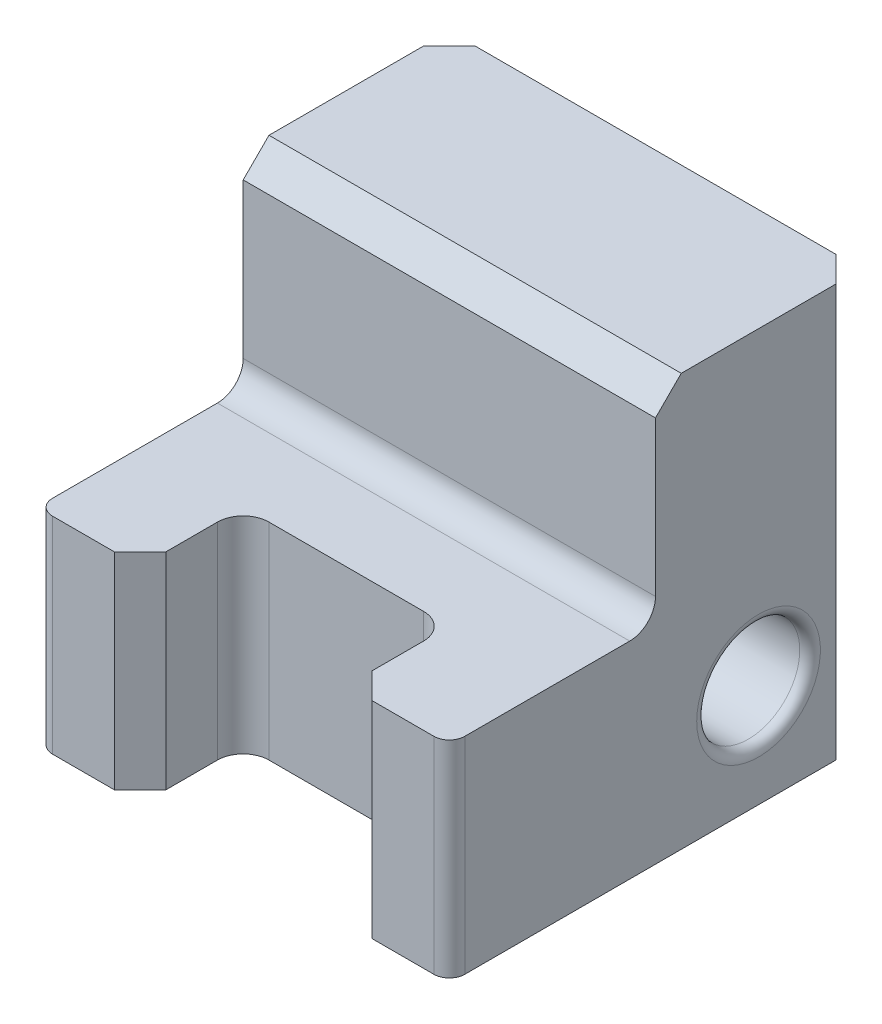
ISO-10303-21;
HEADER;
FILE_DESCRIPTION(('STEP AP214'),'2;1');
FILE_NAME('part.step','',(''),(''),'','','');
FILE_SCHEMA(('AUTOMOTIVE_DESIGN { 1 0 10303 214 1 1 1 1 }'));
ENDSEC;
DATA;
#1=APPLICATION_CONTEXT('core data for automotive mechanical design processes');
#2=APPLICATION_PROTOCOL_DEFINITION('international standard','automotive_design',2000,#1);
#3=PRODUCT_CONTEXT('',#1,'mechanical');
#4=PRODUCT('Part','Part','',(#3));
#5=PRODUCT_RELATED_PRODUCT_CATEGORY('part','',(#4));
#6=PRODUCT_DEFINITION_FORMATION('','',#4);
#7=PRODUCT_DEFINITION_CONTEXT('part definition',#1,'design');
#8=PRODUCT_DEFINITION('design','',#6,#7);
#9=PRODUCT_DEFINITION_SHAPE('','',#8);
#10=(LENGTH_UNIT() NAMED_UNIT(*) SI_UNIT(.MILLI.,.METRE.));
#11=(NAMED_UNIT(*) PLANE_ANGLE_UNIT() SI_UNIT($,.RADIAN.));
#12=(NAMED_UNIT(*) SI_UNIT($,.STERADIAN.) SOLID_ANGLE_UNIT());
#13=UNCERTAINTY_MEASURE_WITH_UNIT(LENGTH_MEASURE(1.E-05),#10,'distance_accuracy_value','');
#14=(GEOMETRIC_REPRESENTATION_CONTEXT(3) GLOBAL_UNCERTAINTY_ASSIGNED_CONTEXT((#13)) GLOBAL_UNIT_ASSIGNED_CONTEXT((#10,
#11,#12)) REPRESENTATION_CONTEXT('',''));
#15=CARTESIAN_POINT('',(0.,0.,0.));
#16=DIRECTION('',(0.,0.,1.));
#17=DIRECTION('',(1.,0.,0.));
#18=AXIS2_PLACEMENT_3D('',#15,#16,#17);
#19=CARTESIAN_POINT('',(80.,0.,80.));
#20=DIRECTION('',(0.,0.,-1.));
#21=DIRECTION('',(-1.,0.,0.));
#22=AXIS2_PLACEMENT_3D('',#19,#20,#21);
#23=PLANE('',#22);
#24=DIRECTION('',(-1.,0.,0.));
#25=VECTOR('',#24,1.);
#26=CARTESIAN_POINT('',(80.,0.,80.));
#27=LINE('',#26,#25);
#28=CARTESIAN_POINT('',(15.,0.,80.));
#29=VERTEX_POINT('',#28);
#30=CARTESIAN_POINT('',(3.,0.,80.));
#31=VERTEX_POINT('',#30);
#32=EDGE_CURVE('E317',#29,#31,#27,.T.);
#33=ORIENTED_EDGE('',*,*,#32,.F.);
#34=DIRECTION('',(0.,1.,0.));
#35=VECTOR('',#34,1.);
#36=CARTESIAN_POINT('',(15.,0.,80.));
#37=LINE('',#36,#35);
#38=CARTESIAN_POINT('',(15.,40.,80.));
#39=VERTEX_POINT('',#38);
#40=EDGE_CURVE('E234',#29,#39,#37,.T.);
#41=ORIENTED_EDGE('',*,*,#40,.T.);
#42=DIRECTION('',(-1.,0.,0.));
#43=VECTOR('',#42,1.);
#44=CARTESIAN_POINT('',(80.,40.,80.));
#45=LINE('',#44,#43);
#46=CARTESIAN_POINT('',(3.,40.,80.));
#47=VERTEX_POINT('',#46);
#48=EDGE_CURVE('E332',#39,#47,#45,.T.);
#49=ORIENTED_EDGE('',*,*,#48,.T.);
#50=DIRECTION('',(0.,-1.,0.));
#51=VECTOR('',#50,1.);
#52=CARTESIAN_POINT('',(3.,0.,80.));
#53=LINE('',#52,#51);
#54=EDGE_CURVE('E194',#47,#31,#53,.T.);
#55=ORIENTED_EDGE('',*,*,#54,.T.);
#56=EDGE_LOOP('',(#33,#41,#49,#55));
#57=FACE_BOUND('',#56,.T.);
#58=ADVANCED_FACE('F35',(#57),#23,.F.);
#59=CARTESIAN_POINT('',(80.,0.,0.));
#60=DIRECTION('',(-1.,0.,0.));
#61=DIRECTION('',(0.,0.,1.));
#62=AXIS2_PLACEMENT_3D('',#59,#60,#61);
#63=PLANE('',#62);
#64=CARTESIAN_POINT('',(80.,20.,20.));
#65=DIRECTION('',(-1.,0.,0.));
#66=DIRECTION('',(0.,0.,1.));
#67=AXIS2_PLACEMENT_3D('',#64,#65,#66);
#68=CIRCLE('',#67,12.);
#69=CARTESIAN_POINT('',(80.,20.,32.));
#70=VERTEX_POINT('',#69);
#71=EDGE_CURVE('E283',#70,#70,#68,.T.);
#72=ORIENTED_EDGE('',*,*,#71,.T.);
#73=EDGE_LOOP('',(#72));
#74=FACE_BOUND('',#73,.T.);
#75=DIRECTION('',(0.,0.,-1.));
#76=VECTOR('',#75,1.);
#77=CARTESIAN_POINT('',(80.,0.,0.));
#78=LINE('',#77,#76);
#79=CARTESIAN_POINT('',(80.,0.,77.));
#80=VERTEX_POINT('',#79);
#81=CARTESIAN_POINT('',(80.,0.,4.99999999999999));
#82=VERTEX_POINT('',#81);
#83=EDGE_CURVE('E183',#80,#82,#78,.T.);
#84=ORIENTED_EDGE('',*,*,#83,.T.);
#85=DIRECTION('',(0.,1.,0.));
#86=VECTOR('',#85,1.);
#87=CARTESIAN_POINT('',(80.,0.,4.99999999999999));
#88=LINE('',#87,#86);
#89=CARTESIAN_POINT('',(80.,80.,4.99999999999999));
#90=VERTEX_POINT('',#89);
#91=EDGE_CURVE('E286',#82,#90,#88,.T.);
#92=ORIENTED_EDGE('',*,*,#91,.T.);
#93=DIRECTION('',(0.,0.,1.));
#94=VECTOR('',#93,1.);
#95=CARTESIAN_POINT('',(80.,80.,40.));
#96=LINE('',#95,#94);
#97=CARTESIAN_POINT('',(80.,80.,35.));
#98=VERTEX_POINT('',#97);
#99=EDGE_CURVE('E310',#90,#98,#96,.T.);
#100=ORIENTED_EDGE('',*,*,#99,.T.);
#101=DIRECTION('',(0.,0.707106781186547,-0.707106781186549));
#102=VECTOR('',#101,1.);
#103=CARTESIAN_POINT('',(80.,75.,40.));
#104=LINE('',#103,#102);
#105=CARTESIAN_POINT('',(80.,75.,40.));
#106=VERTEX_POINT('',#105);
#107=EDGE_CURVE('E272',#98,#106,#104,.F.);
#108=ORIENTED_EDGE('',*,*,#107,.T.);
#109=DIRECTION('',(0.,-1.,0.));
#110=VECTOR('',#109,1.);
#111=CARTESIAN_POINT('',(80.,40.,40.));
#112=LINE('',#111,#110);
#113=CARTESIAN_POINT('',(80.,45.,40.));
#114=VERTEX_POINT('',#113);
#115=EDGE_CURVE('E184',#106,#114,#112,.T.);
#116=ORIENTED_EDGE('',*,*,#115,.T.);
#117=CARTESIAN_POINT('',(80.,45.,45.));
#118=DIRECTION('',(-1.,0.,0.));
#119=DIRECTION('',(0.,0.,1.));
#120=AXIS2_PLACEMENT_3D('',#117,#118,#119);
#121=CIRCLE('',#120,5.);
#122=CARTESIAN_POINT('',(80.,40.,45.));
#123=VERTEX_POINT('',#122);
#124=EDGE_CURVE('E179',#114,#123,#121,.T.);
#125=ORIENTED_EDGE('',*,*,#124,.T.);
#126=DIRECTION('',(0.,0.,1.));
#127=VECTOR('',#126,1.);
#128=CARTESIAN_POINT('',(80.,40.,80.));
#129=LINE('',#128,#127);
#130=CARTESIAN_POINT('',(80.,40.,77.));
#131=VERTEX_POINT('',#130);
#132=EDGE_CURVE('E171',#123,#131,#129,.T.);
#133=ORIENTED_EDGE('',*,*,#132,.T.);
#134=DIRECTION('',(0.,-1.,0.));
#135=VECTOR('',#134,1.);
#136=CARTESIAN_POINT('',(80.,0.,77.));
#137=LINE('',#136,#135);
#138=EDGE_CURVE('E176',#131,#80,#137,.T.);
#139=ORIENTED_EDGE('',*,*,#138,.T.);
#140=EDGE_LOOP('',(#84,#92,#100,#108,#116,#125,#133,#139));
#141=FACE_BOUND('',#140,.T.);
#142=ADVANCED_FACE('F174',(#74,#141),#63,.F.);
#143=CARTESIAN_POINT('',(0.,0.,0.));
#144=DIRECTION('',(-1.,0.,0.));
#145=DIRECTION('',(0.,0.,1.));
#146=AXIS2_PLACEMENT_3D('',#143,#144,#145);
#147=PLANE('',#146);
#148=CARTESIAN_POINT('',(0.,20.,20.));
#149=DIRECTION('',(-1.,0.,0.));
#150=DIRECTION('',(0.,0.,1.));
#151=AXIS2_PLACEMENT_3D('',#148,#149,#150);
#152=CIRCLE('',#151,12.);
#153=CARTESIAN_POINT('',(0.,20.,32.));
#154=VERTEX_POINT('',#153);
#155=EDGE_CURVE('E274',#154,#154,#152,.F.);
#156=ORIENTED_EDGE('',*,*,#155,.T.);
#157=EDGE_LOOP('',(#156));
#158=FACE_BOUND('',#157,.T.);
#159=DIRECTION('',(0.,0.,1.));
#160=VECTOR('',#159,1.);
#161=CARTESIAN_POINT('',(0.,80.,40.));
#162=LINE('',#161,#160);
#163=CARTESIAN_POINT('',(0.,80.,5.));
#164=VERTEX_POINT('',#163);
#165=CARTESIAN_POINT('',(0.,80.,35.));
#166=VERTEX_POINT('',#165);
#167=EDGE_CURVE('E321',#164,#166,#162,.T.);
#168=ORIENTED_EDGE('',*,*,#167,.F.);
#169=DIRECTION('',(0.,-1.,0.));
#170=VECTOR('',#169,1.);
#171=CARTESIAN_POINT('',(0.,0.,5.));
#172=LINE('',#171,#170);
#173=CARTESIAN_POINT('',(0.,0.,5.));
#174=VERTEX_POINT('',#173);
#175=EDGE_CURVE('E43',#164,#174,#172,.T.);
#176=ORIENTED_EDGE('',*,*,#175,.T.);
#177=DIRECTION('',(0.,0.,-1.));
#178=VECTOR('',#177,1.);
#179=CARTESIAN_POINT('',(0.,0.,0.));
#180=LINE('',#179,#178);
#181=CARTESIAN_POINT('',(0.,0.,77.));
#182=VERTEX_POINT('',#181);
#183=EDGE_CURVE('E328',#182,#174,#180,.T.);
#184=ORIENTED_EDGE('',*,*,#183,.F.);
#185=DIRECTION('',(0.,-1.,0.));
#186=VECTOR('',#185,1.);
#187=CARTESIAN_POINT('',(0.,40.,77.));
#188=LINE('',#187,#186);
#189=CARTESIAN_POINT('',(0.,40.,77.));
#190=VERTEX_POINT('',#189);
#191=EDGE_CURVE('E213',#182,#190,#188,.F.);
#192=ORIENTED_EDGE('',*,*,#191,.T.);
#193=DIRECTION('',(0.,0.,1.));
#194=VECTOR('',#193,1.);
#195=CARTESIAN_POINT('',(0.,40.,80.));
#196=LINE('',#195,#194);
#197=CARTESIAN_POINT('',(0.,40.,45.));
#198=VERTEX_POINT('',#197);
#199=EDGE_CURVE('E326',#198,#190,#196,.T.);
#200=ORIENTED_EDGE('',*,*,#199,.F.);
#201=CARTESIAN_POINT('',(0.,45.,45.));
#202=DIRECTION('',(-1.,0.,0.));
#203=DIRECTION('',(0.,0.,1.));
#204=AXIS2_PLACEMENT_3D('',#201,#202,#203);
#205=CIRCLE('',#204,5.);
#206=CARTESIAN_POINT('',(0.,45.,40.));
#207=VERTEX_POINT('',#206);
#208=EDGE_CURVE('E259',#198,#207,#205,.F.);
#209=ORIENTED_EDGE('',*,*,#208,.T.);
#210=DIRECTION('',(0.,-1.,0.));
#211=VECTOR('',#210,1.);
#212=CARTESIAN_POINT('',(0.,40.,40.));
#213=LINE('',#212,#211);
#214=CARTESIAN_POINT('',(0.,75.,40.));
#215=VERTEX_POINT('',#214);
#216=EDGE_CURVE('E323',#215,#207,#213,.T.);
#217=ORIENTED_EDGE('',*,*,#216,.F.);
#218=DIRECTION('',(0.,-0.707106781186547,0.707106781186549));
#219=VECTOR('',#218,1.);
#220=CARTESIAN_POINT('',(0.,57.5000000000001,57.4999999999999));
#221=LINE('',#220,#219);
#222=EDGE_CURVE('E266',#215,#166,#221,.F.);
#223=ORIENTED_EDGE('',*,*,#222,.T.);
#224=EDGE_LOOP('',(#168,#176,#184,#192,#200,#209,#217,#223));
#225=FACE_BOUND('',#224,.T.);
#226=ADVANCED_FACE('F348',(#158,#225),#147,.T.);
#227=CARTESIAN_POINT('',(80.,80.,0.));
#228=DIRECTION('',(0.,0.,1.));
#229=DIRECTION('',(0.,-1.,0.));
#230=AXIS2_PLACEMENT_3D('',#227,#228,#229);
#231=PLANE('',#230);
#232=DIRECTION('',(-1.,0.,0.));
#233=VECTOR('',#232,1.);
#234=CARTESIAN_POINT('',(80.,0.,0.));
#235=LINE('',#234,#233);
#236=CARTESIAN_POINT('',(75.,0.,0.));
#237=VERTEX_POINT('',#236);
#238=CARTESIAN_POINT('',(4.99999999999999,0.,0.));
#239=VERTEX_POINT('',#238);
#240=EDGE_CURVE('E305',#237,#239,#235,.T.);
#241=ORIENTED_EDGE('',*,*,#240,.T.);
#242=DIRECTION('',(0.,1.,0.));
#243=VECTOR('',#242,1.);
#244=CARTESIAN_POINT('',(4.99999999999999,80.,0.));
#245=LINE('',#244,#243);
#246=CARTESIAN_POINT('',(4.99999999999999,80.,0.));
#247=VERTEX_POINT('',#246);
#248=EDGE_CURVE('E295',#239,#247,#245,.T.);
#249=ORIENTED_EDGE('',*,*,#248,.T.);
#250=DIRECTION('',(-1.,0.,0.));
#251=VECTOR('',#250,1.);
#252=CARTESIAN_POINT('',(80.,80.,0.));
#253=LINE('',#252,#251);
#254=CARTESIAN_POINT('',(75.,80.,0.));
#255=VERTEX_POINT('',#254);
#256=EDGE_CURVE('E200',#255,#247,#253,.T.);
#257=ORIENTED_EDGE('',*,*,#256,.F.);
#258=DIRECTION('',(0.,-1.,0.));
#259=VECTOR('',#258,1.);
#260=CARTESIAN_POINT('',(75.,80.,0.));
#261=LINE('',#260,#259);
#262=EDGE_CURVE('E291',#255,#237,#261,.T.);
#263=ORIENTED_EDGE('',*,*,#262,.T.);
#264=EDGE_LOOP('',(#241,#249,#257,#263));
#265=FACE_BOUND('',#264,.T.);
#266=ADVANCED_FACE('F302',(#265),#231,.F.);
#267=CARTESIAN_POINT('',(80.,80.,40.));
#268=DIRECTION('',(0.,-1.,0.));
#269=DIRECTION('',(0.,0.,-1.));
#270=AXIS2_PLACEMENT_3D('',#267,#268,#269);
#271=PLANE('',#270);
#272=ORIENTED_EDGE('',*,*,#256,.T.);
#273=DIRECTION('',(-0.707106781186547,0.,0.707106781186549));
#274=VECTOR('',#273,1.);
#275=CARTESIAN_POINT('',(4.99999999999999,80.,0.));
#276=LINE('',#275,#274);
#277=EDGE_CURVE('E57',#247,#164,#276,.T.);
#278=ORIENTED_EDGE('',*,*,#277,.T.);
#279=ORIENTED_EDGE('',*,*,#167,.T.);
#280=DIRECTION('',(1.,0.,0.));
#281=VECTOR('',#280,1.);
#282=CARTESIAN_POINT('',(80.,80.,35.));
#283=LINE('',#282,#281);
#284=EDGE_CURVE('E269',#166,#98,#283,.T.);
#285=ORIENTED_EDGE('',*,*,#284,.T.);
#286=ORIENTED_EDGE('',*,*,#99,.F.);
#287=DIRECTION('',(0.707106781186549,0.,0.707106781186547));
#288=VECTOR('',#287,1.);
#289=CARTESIAN_POINT('',(80.,80.,4.99999999999999));
#290=LINE('',#289,#288);
#291=EDGE_CURVE('E289',#90,#255,#290,.F.);
#292=ORIENTED_EDGE('',*,*,#291,.T.);
#293=EDGE_LOOP('',(#272,#278,#279,#285,#286,#292));
#294=FACE_BOUND('',#293,.T.);
#295=ADVANCED_FACE('F308',(#294),#271,.F.);
#296=CARTESIAN_POINT('',(80.,40.,40.));
#297=DIRECTION('',(0.,0.,-1.));
#298=DIRECTION('',(-1.,0.,0.));
#299=AXIS2_PLACEMENT_3D('',#296,#297,#298);
#300=PLANE('',#299);
#301=ORIENTED_EDGE('',*,*,#115,.F.);
#302=DIRECTION('',(-1.,0.,0.));
#303=VECTOR('',#302,1.);
#304=CARTESIAN_POINT('',(80.,75.,40.));
#305=LINE('',#304,#303);
#306=EDGE_CURVE('E263',#106,#215,#305,.T.);
#307=ORIENTED_EDGE('',*,*,#306,.T.);
#308=ORIENTED_EDGE('',*,*,#216,.T.);
#309=DIRECTION('',(-1.,0.,0.));
#310=VECTOR('',#309,1.);
#311=CARTESIAN_POINT('',(80.,45.,40.));
#312=LINE('',#311,#310);
#313=EDGE_CURVE('E256',#207,#114,#312,.F.);
#314=ORIENTED_EDGE('',*,*,#313,.T.);
#315=EDGE_LOOP('',(#301,#307,#308,#314));
#316=FACE_BOUND('',#315,.T.);
#317=ADVANCED_FACE('F355',(#316),#300,.F.);
#318=CARTESIAN_POINT('',(80.,40.,80.));
#319=DIRECTION('',(0.,-1.,0.));
#320=DIRECTION('',(0.,0.,-1.));
#321=AXIS2_PLACEMENT_3D('',#318,#319,#320);
#322=PLANE('',#321);
#323=ORIENTED_EDGE('',*,*,#132,.F.);
#324=DIRECTION('',(-1.,0.,0.));
#325=VECTOR('',#324,1.);
#326=CARTESIAN_POINT('',(0.,40.,45.));
#327=LINE('',#326,#325);
#328=EDGE_CURVE('E254',#123,#198,#327,.T.);
#329=ORIENTED_EDGE('',*,*,#328,.T.);
#330=ORIENTED_EDGE('',*,*,#199,.T.);
#331=CARTESIAN_POINT('',(3.,40.,77.));
#332=DIRECTION('',(0.,-1.,0.));
#333=DIRECTION('',(0.,0.,-1.));
#334=AXIS2_PLACEMENT_3D('',#331,#332,#333);
#335=CIRCLE('',#334,3.);
#336=EDGE_CURVE('E195',#190,#47,#335,.F.);
#337=ORIENTED_EDGE('',*,*,#336,.T.);
#338=ORIENTED_EDGE('',*,*,#48,.F.);
#339=DIRECTION('',(-0.70710678118655,0.,0.707106781186545));
#340=VECTOR('',#339,1.);
#341=CARTESIAN_POINT('',(20.,40.,75.));
#342=LINE('',#341,#340);
#343=CARTESIAN_POINT('',(20.,40.,75.));
#344=VERTEX_POINT('',#343);
#345=EDGE_CURVE('E227',#39,#344,#342,.F.);
#346=ORIENTED_EDGE('',*,*,#345,.T.);
#347=DIRECTION('',(0.,0.,-1.));
#348=VECTOR('',#347,1.);
#349=CARTESIAN_POINT('',(20.,40.,80.));
#350=LINE('',#349,#348);
#351=CARTESIAN_POINT('',(20.,40.,65.));
#352=VERTEX_POINT('',#351);
#353=EDGE_CURVE('E324',#344,#352,#350,.T.);
#354=ORIENTED_EDGE('',*,*,#353,.T.);
#355=CARTESIAN_POINT('',(25.,40.,65.));
#356=DIRECTION('',(0.,-1.,0.));
#357=DIRECTION('',(0.,0.,-1.));
#358=AXIS2_PLACEMENT_3D('',#355,#356,#357);
#359=CIRCLE('',#358,5.);
#360=CARTESIAN_POINT('',(25.,40.,60.));
#361=VERTEX_POINT('',#360);
#362=EDGE_CURVE('E248',#352,#361,#359,.T.);
#363=ORIENTED_EDGE('',*,*,#362,.T.);
#364=DIRECTION('',(1.,0.,0.));
#365=VECTOR('',#364,1.);
#366=CARTESIAN_POINT('',(80.,40.,60.));
#367=LINE('',#366,#365);
#368=CARTESIAN_POINT('',(55.,40.,60.));
#369=VERTEX_POINT('',#368);
#370=EDGE_CURVE('E463',#361,#369,#367,.T.);
#371=ORIENTED_EDGE('',*,*,#370,.T.);
#372=CARTESIAN_POINT('',(55.,40.,65.));
#373=DIRECTION('',(0.,-1.,0.));
#374=DIRECTION('',(0.,0.,-1.));
#375=AXIS2_PLACEMENT_3D('',#372,#373,#374);
#376=CIRCLE('',#375,5.);
#377=CARTESIAN_POINT('',(60.,40.,65.));
#378=VERTEX_POINT('',#377);
#379=EDGE_CURVE('E252',#369,#378,#376,.T.);
#380=ORIENTED_EDGE('',*,*,#379,.T.);
#381=DIRECTION('',(0.,0.,1.));
#382=VECTOR('',#381,1.);
#383=CARTESIAN_POINT('',(60.,40.,80.));
#384=LINE('',#383,#382);
#385=CARTESIAN_POINT('',(60.,40.,75.));
#386=VERTEX_POINT('',#385);
#387=EDGE_CURVE('E458',#378,#386,#384,.T.);
#388=ORIENTED_EDGE('',*,*,#387,.T.);
#389=DIRECTION('',(-0.707106781186544,0.,-0.707106781186551));
#390=VECTOR('',#389,1.);
#391=CARTESIAN_POINT('',(64.9999999999999,40.,80.));
#392=LINE('',#391,#390);
#393=CARTESIAN_POINT('',(64.9999999999999,40.,80.));
#394=VERTEX_POINT('',#393);
#395=EDGE_CURVE('E229',#386,#394,#392,.F.);
#396=ORIENTED_EDGE('',*,*,#395,.T.);
#397=CARTESIAN_POINT('',(77.,40.,80.));
#398=VERTEX_POINT('',#397);
#399=EDGE_CURVE('E191',#398,#394,#45,.T.);
#400=ORIENTED_EDGE('',*,*,#399,.F.);
#401=CARTESIAN_POINT('',(77.,40.,77.));
#402=DIRECTION('',(0.,-1.,0.));
#403=DIRECTION('',(0.,0.,-1.));
#404=AXIS2_PLACEMENT_3D('',#401,#402,#403);
#405=CIRCLE('',#404,3.);
#406=EDGE_CURVE('E188',#398,#131,#405,.F.);
#407=ORIENTED_EDGE('',*,*,#406,.T.);
#408=EDGE_LOOP('',(#323,#329,#330,#337,#338,#346,#354,#363,#371,#380,#388,#396,#400,#407));
#409=FACE_BOUND('',#408,.T.);
#410=ADVANCED_FACE('F189',(#409),#322,.F.);
#411=ORIENTED_EDGE('',*,*,#399,.T.);
#412=DIRECTION('',(0.,-1.,0.));
#413=VECTOR('',#412,1.);
#414=CARTESIAN_POINT('',(64.9999999999999,0.,80.));
#415=LINE('',#414,#413);
#416=CARTESIAN_POINT('',(64.9999999999999,0.,80.));
#417=VERTEX_POINT('',#416);
#418=EDGE_CURVE('E216',#394,#417,#415,.T.);
#419=ORIENTED_EDGE('',*,*,#418,.T.);
#420=CARTESIAN_POINT('',(77.,0.,80.));
#421=VERTEX_POINT('',#420);
#422=EDGE_CURVE('E330',#421,#417,#27,.T.);
#423=ORIENTED_EDGE('',*,*,#422,.F.);
#424=DIRECTION('',(0.,-1.,0.));
#425=VECTOR('',#424,1.);
#426=CARTESIAN_POINT('',(77.,0.,80.));
#427=LINE('',#426,#425);
#428=EDGE_CURVE('E207',#421,#398,#427,.F.);
#429=ORIENTED_EDGE('',*,*,#428,.T.);
#430=EDGE_LOOP('',(#411,#419,#423,#429));
#431=FACE_BOUND('',#430,.T.);
#432=ADVANCED_FACE('F368',(#431),#23,.F.);
#433=CARTESIAN_POINT('',(80.,0.,0.));
#434=DIRECTION('',(0.,1.,0.));
#435=DIRECTION('',(0.,0.,1.));
#436=AXIS2_PLACEMENT_3D('',#433,#434,#435);
#437=PLANE('',#436);
#438=ORIENTED_EDGE('',*,*,#183,.T.);
#439=DIRECTION('',(0.707106781186547,0.,-0.707106781186549));
#440=VECTOR('',#439,1.);
#441=CARTESIAN_POINT('',(5.,0.,0.));
#442=LINE('',#441,#440);
#443=EDGE_CURVE('E12',#174,#239,#442,.T.);
#444=ORIENTED_EDGE('',*,*,#443,.T.);
#445=ORIENTED_EDGE('',*,*,#240,.F.);
#446=DIRECTION('',(-0.707106781186549,0.,-0.707106781186547));
#447=VECTOR('',#446,1.);
#448=CARTESIAN_POINT('',(80.,0.,4.99999999999999));
#449=LINE('',#448,#447);
#450=EDGE_CURVE('E293',#237,#82,#449,.F.);
#451=ORIENTED_EDGE('',*,*,#450,.T.);
#452=ORIENTED_EDGE('',*,*,#83,.F.);
#453=CARTESIAN_POINT('',(77.,0.,77.));
#454=DIRECTION('',(0.,1.,0.));
#455=DIRECTION('',(0.,0.,1.));
#456=AXIS2_PLACEMENT_3D('',#453,#454,#455);
#457=CIRCLE('',#456,3.);
#458=EDGE_CURVE('E198',#80,#421,#457,.F.);
#459=ORIENTED_EDGE('',*,*,#458,.T.);
#460=ORIENTED_EDGE('',*,*,#422,.T.);
#461=DIRECTION('',(0.707106781186544,0.,0.707106781186551));
#462=VECTOR('',#461,1.);
#463=CARTESIAN_POINT('',(64.9999999999999,0.,80.));
#464=LINE('',#463,#462);
#465=CARTESIAN_POINT('',(60.,0.,75.));
#466=VERTEX_POINT('',#465);
#467=EDGE_CURVE('E221',#417,#466,#464,.F.);
#468=ORIENTED_EDGE('',*,*,#467,.T.);
#469=DIRECTION('',(0.,0.,1.));
#470=VECTOR('',#469,1.);
#471=CARTESIAN_POINT('',(60.,0.,80.));
#472=LINE('',#471,#470);
#473=CARTESIAN_POINT('',(60.,0.,65.));
#474=VERTEX_POINT('',#473);
#475=EDGE_CURVE('E470',#474,#466,#472,.T.);
#476=ORIENTED_EDGE('',*,*,#475,.F.);
#477=CARTESIAN_POINT('',(55.,0.,65.));
#478=DIRECTION('',(0.,1.,0.));
#479=DIRECTION('',(0.,0.,1.));
#480=AXIS2_PLACEMENT_3D('',#477,#478,#479);
#481=CIRCLE('',#480,5.);
#482=CARTESIAN_POINT('',(55.,0.,60.));
#483=VERTEX_POINT('',#482);
#484=EDGE_CURVE('E250',#474,#483,#481,.T.);
#485=ORIENTED_EDGE('',*,*,#484,.T.);
#486=DIRECTION('',(1.,0.,0.));
#487=VECTOR('',#486,1.);
#488=CARTESIAN_POINT('',(20.,0.,60.));
#489=LINE('',#488,#487);
#490=CARTESIAN_POINT('',(25.,0.,60.));
#491=VERTEX_POINT('',#490);
#492=EDGE_CURVE('E469',#491,#483,#489,.T.);
#493=ORIENTED_EDGE('',*,*,#492,.F.);
#494=CARTESIAN_POINT('',(25.,0.,65.));
#495=DIRECTION('',(0.,1.,0.));
#496=DIRECTION('',(0.,0.,1.));
#497=AXIS2_PLACEMENT_3D('',#494,#495,#496);
#498=CIRCLE('',#497,5.);
#499=CARTESIAN_POINT('',(20.,0.,65.));
#500=VERTEX_POINT('',#499);
#501=EDGE_CURVE('E246',#491,#500,#498,.T.);
#502=ORIENTED_EDGE('',*,*,#501,.T.);
#503=DIRECTION('',(0.,0.,-1.));
#504=VECTOR('',#503,1.);
#505=CARTESIAN_POINT('',(20.,0.,80.));
#506=LINE('',#505,#504);
#507=CARTESIAN_POINT('',(20.,0.,75.));
#508=VERTEX_POINT('',#507);
#509=EDGE_CURVE('E474',#508,#500,#506,.T.);
#510=ORIENTED_EDGE('',*,*,#509,.F.);
#511=DIRECTION('',(0.70710678118655,0.,-0.707106781186545));
#512=VECTOR('',#511,1.);
#513=CARTESIAN_POINT('',(20.,0.,75.));
#514=LINE('',#513,#512);
#515=EDGE_CURVE('E219',#508,#29,#514,.F.);
#516=ORIENTED_EDGE('',*,*,#515,.T.);
#517=ORIENTED_EDGE('',*,*,#32,.T.);
#518=CARTESIAN_POINT('',(3.,0.,77.));
#519=DIRECTION('',(0.,1.,0.));
#520=DIRECTION('',(0.,0.,1.));
#521=AXIS2_PLACEMENT_3D('',#518,#519,#520);
#522=CIRCLE('',#521,3.);
#523=EDGE_CURVE('E199',#31,#182,#522,.F.);
#524=ORIENTED_EDGE('',*,*,#523,.T.);
#525=EDGE_LOOP('',(#438,#444,#445,#451,#452,#459,#460,#468,#476,#485,#493,#502,#510,#516,#517,#524));
#526=FACE_BOUND('',#525,.T.);
#527=ADVANCED_FACE('F347',(#526),#437,.F.);
#528=CARTESIAN_POINT('',(80.,20.,20.));
#529=DIRECTION('',(-1.,0.,0.));
#530=DIRECTION('',(0.,0.,1.));
#531=AXIS2_PLACEMENT_3D('',#528,#529,#530);
#532=CYLINDRICAL_SURFACE('',#531,10.);
#533=CARTESIAN_POINT('',(78.,20.,20.));
#534=DIRECTION('',(-1.,0.,0.));
#535=DIRECTION('',(0.,0.,1.));
#536=AXIS2_PLACEMENT_3D('',#533,#534,#535);
#537=CIRCLE('',#536,10.);
#538=CARTESIAN_POINT('',(78.,20.,30.));
#539=VERTEX_POINT('',#538);
#540=EDGE_CURVE('E280',#539,#539,#537,.F.);
#541=ORIENTED_EDGE('',*,*,#540,.T.);
#542=EDGE_LOOP('',(#541));
#543=FACE_BOUND('',#542,.T.);
#544=CARTESIAN_POINT('',(2.,20.,20.));
#545=DIRECTION('',(-1.,0.,0.));
#546=DIRECTION('',(0.,0.,1.));
#547=AXIS2_PLACEMENT_3D('',#544,#545,#546);
#548=CIRCLE('',#547,10.);
#549=CARTESIAN_POINT('',(2.,20.,30.));
#550=VERTEX_POINT('',#549);
#551=EDGE_CURVE('E277',#550,#550,#548,.T.);
#552=ORIENTED_EDGE('',*,*,#551,.T.);
#553=EDGE_LOOP('',(#552));
#554=FACE_BOUND('',#553,.T.);
#555=ADVANCED_FACE('F382',(#543,#554),#532,.F.);
#556=CARTESIAN_POINT('',(20.,80.,80.));
#557=DIRECTION('',(-1.,0.,0.));
#558=DIRECTION('',(0.,0.,1.));
#559=AXIS2_PLACEMENT_3D('',#556,#557,#558);
#560=PLANE('',#559);
#561=ORIENTED_EDGE('',*,*,#509,.T.);
#562=DIRECTION('',(0.,-1.,0.));
#563=VECTOR('',#562,1.);
#564=CARTESIAN_POINT('',(20.,40.,65.));
#565=LINE('',#564,#563);
#566=EDGE_CURVE('E241',#500,#352,#565,.F.);
#567=ORIENTED_EDGE('',*,*,#566,.T.);
#568=ORIENTED_EDGE('',*,*,#353,.F.);
#569=DIRECTION('',(0.,-1.,0.));
#570=VECTOR('',#569,1.);
#571=CARTESIAN_POINT('',(20.,80.,75.));
#572=LINE('',#571,#570);
#573=EDGE_CURVE('E231',#344,#508,#572,.T.);
#574=ORIENTED_EDGE('',*,*,#573,.T.);
#575=EDGE_LOOP('',(#561,#567,#568,#574));
#576=FACE_BOUND('',#575,.T.);
#577=ADVANCED_FACE('F434',(#576),#560,.F.);
#578=CARTESIAN_POINT('',(60.,80.,80.));
#579=DIRECTION('',(1.,0.,0.));
#580=DIRECTION('',(0.,0.,-1.));
#581=AXIS2_PLACEMENT_3D('',#578,#579,#580);
#582=PLANE('',#581);
#583=ORIENTED_EDGE('',*,*,#387,.F.);
#584=DIRECTION('',(0.,-1.,0.));
#585=VECTOR('',#584,1.);
#586=CARTESIAN_POINT('',(60.,0.,65.));
#587=LINE('',#586,#585);
#588=EDGE_CURVE('E243',#378,#474,#587,.T.);
#589=ORIENTED_EDGE('',*,*,#588,.T.);
#590=ORIENTED_EDGE('',*,*,#475,.T.);
#591=DIRECTION('',(0.,1.,0.));
#592=VECTOR('',#591,1.);
#593=CARTESIAN_POINT('',(60.,80.,75.));
#594=LINE('',#593,#592);
#595=EDGE_CURVE('E224',#466,#386,#594,.T.);
#596=ORIENTED_EDGE('',*,*,#595,.T.);
#597=EDGE_LOOP('',(#583,#589,#590,#596));
#598=FACE_BOUND('',#597,.T.);
#599=ADVANCED_FACE('F448',(#598),#582,.F.);
#600=CARTESIAN_POINT('',(20.,80.,60.));
#601=DIRECTION('',(0.,0.,-1.));
#602=DIRECTION('',(-1.,0.,0.));
#603=AXIS2_PLACEMENT_3D('',#600,#601,#602);
#604=PLANE('',#603);
#605=ORIENTED_EDGE('',*,*,#370,.F.);
#606=DIRECTION('',(0.,-1.,0.));
#607=VECTOR('',#606,1.);
#608=CARTESIAN_POINT('',(25.,0.,60.));
#609=LINE('',#608,#607);
#610=EDGE_CURVE('E238',#361,#491,#609,.T.);
#611=ORIENTED_EDGE('',*,*,#610,.T.);
#612=ORIENTED_EDGE('',*,*,#492,.T.);
#613=DIRECTION('',(0.,-1.,0.));
#614=VECTOR('',#613,1.);
#615=CARTESIAN_POINT('',(55.,40.,60.));
#616=LINE('',#615,#614);
#617=EDGE_CURVE('E236',#483,#369,#616,.F.);
#618=ORIENTED_EDGE('',*,*,#617,.T.);
#619=EDGE_LOOP('',(#605,#611,#612,#618));
#620=FACE_BOUND('',#619,.T.);
#621=ADVANCED_FACE('F397',(#620),#604,.F.);
#622=CARTESIAN_POINT('',(77.,0.,77.));
#623=DIRECTION('',(0.,-1.,0.));
#624=DIRECTION('',(0.,0.,-1.));
#625=AXIS2_PLACEMENT_3D('',#622,#623,#624);
#626=CYLINDRICAL_SURFACE('',#625,3.);
#627=ORIENTED_EDGE('',*,*,#406,.F.);
#628=ORIENTED_EDGE('',*,*,#428,.F.);
#629=ORIENTED_EDGE('',*,*,#458,.F.);
#630=ORIENTED_EDGE('',*,*,#138,.F.);
#631=EDGE_LOOP('',(#627,#628,#629,#630));
#632=FACE_BOUND('',#631,.T.);
#633=ADVANCED_FACE('F197',(#632),#626,.T.);
#634=CARTESIAN_POINT('',(3.,0.,77.));
#635=DIRECTION('',(0.,1.,0.));
#636=DIRECTION('',(0.,0.,1.));
#637=AXIS2_PLACEMENT_3D('',#634,#635,#636);
#638=CYLINDRICAL_SURFACE('',#637,3.);
#639=ORIENTED_EDGE('',*,*,#336,.F.);
#640=ORIENTED_EDGE('',*,*,#191,.F.);
#641=ORIENTED_EDGE('',*,*,#523,.F.);
#642=ORIENTED_EDGE('',*,*,#54,.F.);
#643=EDGE_LOOP('',(#639,#640,#641,#642));
#644=FACE_BOUND('',#643,.T.);
#645=ADVANCED_FACE('F346',(#644),#638,.T.);
#646=CARTESIAN_POINT('',(64.9999999999999,0.,80.));
#647=DIRECTION('',(0.707106781186551,0.,-0.707106781186544));
#648=DIRECTION('',(0.,-1.,0.));
#649=AXIS2_PLACEMENT_3D('',#646,#647,#648);
#650=PLANE('',#649);
#651=ORIENTED_EDGE('',*,*,#395,.F.);
#652=ORIENTED_EDGE('',*,*,#595,.F.);
#653=ORIENTED_EDGE('',*,*,#467,.F.);
#654=ORIENTED_EDGE('',*,*,#418,.F.);
#655=EDGE_LOOP('',(#651,#652,#653,#654));
#656=FACE_BOUND('',#655,.T.);
#657=ADVANCED_FACE('F400',(#656),#650,.F.);
#658=CARTESIAN_POINT('',(20.,80.,75.));
#659=DIRECTION('',(-0.707106781186545,0.,-0.70710678118655));
#660=DIRECTION('',(0.,-1.,0.));
#661=AXIS2_PLACEMENT_3D('',#658,#659,#660);
#662=PLANE('',#661);
#663=ORIENTED_EDGE('',*,*,#345,.F.);
#664=ORIENTED_EDGE('',*,*,#40,.F.);
#665=ORIENTED_EDGE('',*,*,#515,.F.);
#666=ORIENTED_EDGE('',*,*,#573,.F.);
#667=EDGE_LOOP('',(#663,#664,#665,#666));
#668=FACE_BOUND('',#667,.T.);
#669=ADVANCED_FACE('F403',(#668),#662,.F.);
#670=CARTESIAN_POINT('',(25.,80.,65.));
#671=DIRECTION('',(0.,1.,0.));
#672=DIRECTION('',(0.,0.,1.));
#673=AXIS2_PLACEMENT_3D('',#670,#671,#672);
#674=CYLINDRICAL_SURFACE('',#673,5.);
#675=ORIENTED_EDGE('',*,*,#362,.F.);
#676=ORIENTED_EDGE('',*,*,#566,.F.);
#677=ORIENTED_EDGE('',*,*,#501,.F.);
#678=ORIENTED_EDGE('',*,*,#610,.F.);
#679=EDGE_LOOP('',(#675,#676,#677,#678));
#680=FACE_BOUND('',#679,.T.);
#681=ADVANCED_FACE('F407',(#680),#674,.F.);
#682=CARTESIAN_POINT('',(55.,80.,65.));
#683=DIRECTION('',(0.,1.,0.));
#684=DIRECTION('',(0.,0.,1.));
#685=AXIS2_PLACEMENT_3D('',#682,#683,#684);
#686=CYLINDRICAL_SURFACE('',#685,5.);
#687=ORIENTED_EDGE('',*,*,#379,.F.);
#688=ORIENTED_EDGE('',*,*,#617,.F.);
#689=ORIENTED_EDGE('',*,*,#484,.F.);
#690=ORIENTED_EDGE('',*,*,#588,.F.);
#691=EDGE_LOOP('',(#687,#688,#689,#690));
#692=FACE_BOUND('',#691,.T.);
#693=ADVANCED_FACE('F411',(#692),#686,.F.);
#694=CARTESIAN_POINT('',(80.,45.,45.));
#695=DIRECTION('',(1.,0.,0.));
#696=DIRECTION('',(0.,0.,-1.));
#697=AXIS2_PLACEMENT_3D('',#694,#695,#696);
#698=CYLINDRICAL_SURFACE('',#697,5.);
#699=ORIENTED_EDGE('',*,*,#124,.F.);
#700=ORIENTED_EDGE('',*,*,#313,.F.);
#701=ORIENTED_EDGE('',*,*,#208,.F.);
#702=ORIENTED_EDGE('',*,*,#328,.F.);
#703=EDGE_LOOP('',(#699,#700,#701,#702));
#704=FACE_BOUND('',#703,.T.);
#705=ADVANCED_FACE('F352',(#704),#698,.F.);
#706=CARTESIAN_POINT('',(80.,75.,40.));
#707=DIRECTION('',(0.,-0.707106781186548,-0.707106781186546));
#708=DIRECTION('',(-1.,0.,0.));
#709=AXIS2_PLACEMENT_3D('',#706,#707,#708);
#710=PLANE('',#709);
#711=ORIENTED_EDGE('',*,*,#107,.F.);
#712=ORIENTED_EDGE('',*,*,#284,.F.);
#713=ORIENTED_EDGE('',*,*,#222,.F.);
#714=ORIENTED_EDGE('',*,*,#306,.F.);
#715=EDGE_LOOP('',(#711,#712,#713,#714));
#716=FACE_BOUND('',#715,.T.);
#717=ADVANCED_FACE('F359',(#716),#710,.F.);
#718=CARTESIAN_POINT('',(2.,20.,20.));
#719=DIRECTION('',(-1.,0.,0.));
#720=DIRECTION('',(0.,0.,1.));
#721=AXIS2_PLACEMENT_3D('',#718,#719,#720);
#722=TOROIDAL_SURFACE('',#721,12.,2.);
#723=ORIENTED_EDGE('',*,*,#551,.F.);
#724=EDGE_LOOP('',(#723));
#725=FACE_BOUND('',#724,.T.);
#726=ORIENTED_EDGE('',*,*,#155,.F.);
#727=EDGE_LOOP('',(#726));
#728=FACE_BOUND('',#727,.T.);
#729=ADVANCED_FACE('F420',(#725,#728),#722,.T.);
#730=CARTESIAN_POINT('',(78.,20.,20.));
#731=DIRECTION('',(-1.,0.,0.));
#732=DIRECTION('',(0.,0.,1.));
#733=AXIS2_PLACEMENT_3D('',#730,#731,#732);
#734=TOROIDAL_SURFACE('',#733,12.,2.);
#735=ORIENTED_EDGE('',*,*,#71,.F.);
#736=EDGE_LOOP('',(#735));
#737=FACE_BOUND('',#736,.T.);
#738=ORIENTED_EDGE('',*,*,#540,.F.);
#739=EDGE_LOOP('',(#738));
#740=FACE_BOUND('',#739,.T.);
#741=ADVANCED_FACE('F365',(#737,#740),#734,.T.);
#742=CARTESIAN_POINT('',(80.,0.,4.99999999999999));
#743=DIRECTION('',(-0.707106781186546,0.,0.707106781186548));
#744=DIRECTION('',(0.,1.,0.));
#745=AXIS2_PLACEMENT_3D('',#742,#743,#744);
#746=PLANE('',#745);
#747=ORIENTED_EDGE('',*,*,#450,.F.);
#748=ORIENTED_EDGE('',*,*,#262,.F.);
#749=ORIENTED_EDGE('',*,*,#291,.F.);
#750=ORIENTED_EDGE('',*,*,#91,.F.);
#751=EDGE_LOOP('',(#747,#748,#749,#750));
#752=FACE_BOUND('',#751,.T.);
#753=ADVANCED_FACE('F314',(#752),#746,.F.);
#754=CARTESIAN_POINT('',(4.99999999999999,80.,0.));
#755=DIRECTION('',(-0.707106781186548,0.,-0.707106781186546));
#756=DIRECTION('',(0.,-1.,0.));
#757=AXIS2_PLACEMENT_3D('',#754,#755,#756);
#758=PLANE('',#757);
#759=ORIENTED_EDGE('',*,*,#443,.F.);
#760=ORIENTED_EDGE('',*,*,#175,.F.);
#761=ORIENTED_EDGE('',*,*,#277,.F.);
#762=ORIENTED_EDGE('',*,*,#248,.F.);
#763=EDGE_LOOP('',(#759,#760,#761,#762));
#764=FACE_BOUND('',#763,.T.);
#765=ADVANCED_FACE('F37',(#764),#758,.T.);
#766=CLOSED_SHELL('',(#58,#142,#226,#266,#295,#317,#410,#432,#527,#555,#577,#599,#621,#633,#645,
#657,#669,#681,#693,#705,#717,#729,#741,#753,#765));
#767=MANIFOLD_SOLID_BREP('B2',#766);
#768=ADVANCED_BREP_SHAPE_REPRESENTATION('',(#18,#767),#14);
#769=SHAPE_DEFINITION_REPRESENTATION(#9,#768);
ENDSEC;
END-ISO-10303-21;
